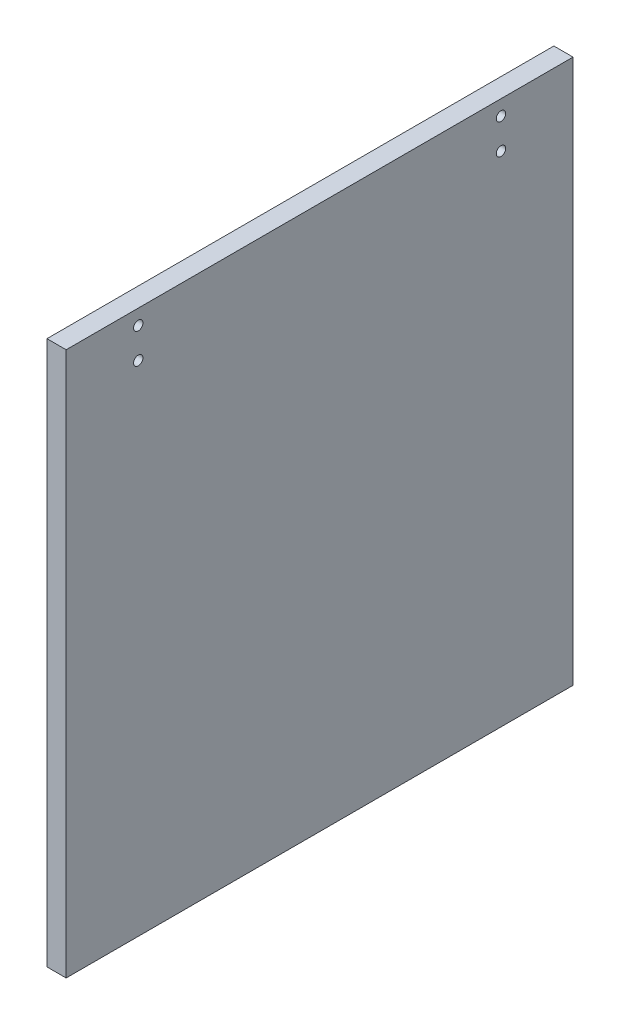
ISO-10303-21;
HEADER;
FILE_DESCRIPTION(('STEP AP214'),'2;1');
FILE_NAME('part.step','',(''),(''),'','','');
FILE_SCHEMA(('AUTOMOTIVE_DESIGN { 1 0 10303 214 1 1 1 1 }'));
ENDSEC;
DATA;
#1=APPLICATION_CONTEXT('core data for automotive mechanical design processes');
#2=APPLICATION_PROTOCOL_DEFINITION('international standard','automotive_design',2000,#1);
#3=PRODUCT_CONTEXT('',#1,'mechanical');
#4=PRODUCT('Part','Part','',(#3));
#5=PRODUCT_RELATED_PRODUCT_CATEGORY('part','',(#4));
#6=PRODUCT_DEFINITION_FORMATION('','',#4);
#7=PRODUCT_DEFINITION_CONTEXT('part definition',#1,'design');
#8=PRODUCT_DEFINITION('design','',#6,#7);
#9=PRODUCT_DEFINITION_SHAPE('','',#8);
#10=(LENGTH_UNIT() NAMED_UNIT(*) SI_UNIT(.MILLI.,.METRE.));
#11=(NAMED_UNIT(*) PLANE_ANGLE_UNIT() SI_UNIT($,.RADIAN.));
#12=(NAMED_UNIT(*) SI_UNIT($,.STERADIAN.) SOLID_ANGLE_UNIT());
#13=UNCERTAINTY_MEASURE_WITH_UNIT(LENGTH_MEASURE(1.E-05),#10,'distance_accuracy_value','');
#14=(GEOMETRIC_REPRESENTATION_CONTEXT(3) GLOBAL_UNCERTAINTY_ASSIGNED_CONTEXT((#13)) GLOBAL_UNIT_ASSIGNED_CONTEXT((#10,
#11,#12)) REPRESENTATION_CONTEXT('',''));
#15=CARTESIAN_POINT('',(0.,0.,0.));
#16=DIRECTION('',(0.,0.,1.));
#17=DIRECTION('',(1.,0.,0.));
#18=AXIS2_PLACEMENT_3D('',#15,#16,#17);
#19=CARTESIAN_POINT('',(6.35,-90.,83.85));
#20=DIRECTION('',(0.,0.,-1.));
#21=DIRECTION('',(-1.,0.,0.));
#22=AXIS2_PLACEMENT_3D('',#19,#20,#21);
#23=PLANE('',#22);
#24=DIRECTION('',(0.,-1.,0.));
#25=VECTOR('',#24,1.);
#26=CARTESIAN_POINT('',(0.,-90.,83.85));
#27=LINE('',#26,#25);
#28=CARTESIAN_POINT('',(0.,90.,83.85));
#29=VERTEX_POINT('',#28);
#30=CARTESIAN_POINT('',(0.,-90.,83.85));
#31=VERTEX_POINT('',#30);
#32=EDGE_CURVE('E96',#29,#31,#27,.T.);
#33=ORIENTED_EDGE('',*,*,#32,.T.);
#34=DIRECTION('',(-1.,0.,0.));
#35=VECTOR('',#34,1.);
#36=CARTESIAN_POINT('',(6.35,-90.,83.85));
#37=LINE('',#36,#35);
#38=CARTESIAN_POINT('',(6.35,-90.,83.85));
#39=VERTEX_POINT('',#38);
#40=EDGE_CURVE('E11',#39,#31,#37,.T.);
#41=ORIENTED_EDGE('',*,*,#40,.F.);
#42=DIRECTION('',(0.,-1.,0.));
#43=VECTOR('',#42,1.);
#44=CARTESIAN_POINT('',(6.35,-90.,83.85));
#45=LINE('',#44,#43);
#46=CARTESIAN_POINT('',(6.35,90.,83.85));
#47=VERTEX_POINT('',#46);
#48=EDGE_CURVE('E84',#47,#39,#45,.T.);
#49=ORIENTED_EDGE('',*,*,#48,.F.);
#50=DIRECTION('',(-1.,0.,0.));
#51=VECTOR('',#50,1.);
#52=CARTESIAN_POINT('',(6.35,90.,83.85));
#53=LINE('',#52,#51);
#54=EDGE_CURVE('E92',#47,#29,#53,.T.);
#55=ORIENTED_EDGE('',*,*,#54,.T.);
#56=EDGE_LOOP('',(#33,#41,#49,#55));
#57=FACE_BOUND('',#56,.T.);
#58=ADVANCED_FACE('F33',(#57),#23,.F.);
#59=CARTESIAN_POINT('',(6.35,-90.,-83.85));
#60=DIRECTION('',(0.,1.,0.));
#61=DIRECTION('',(0.,0.,1.));
#62=AXIS2_PLACEMENT_3D('',#59,#60,#61);
#63=PLANE('',#62);
#64=DIRECTION('',(0.,0.,-1.));
#65=VECTOR('',#64,1.);
#66=CARTESIAN_POINT('',(0.,-90.,-83.85));
#67=LINE('',#66,#65);
#68=CARTESIAN_POINT('',(0.,-90.,-83.85));
#69=VERTEX_POINT('',#68);
#70=EDGE_CURVE('E88',#31,#69,#67,.T.);
#71=ORIENTED_EDGE('',*,*,#70,.T.);
#72=DIRECTION('',(-1.,0.,0.));
#73=VECTOR('',#72,1.);
#74=CARTESIAN_POINT('',(6.35,-90.,-83.85));
#75=LINE('',#74,#73);
#76=CARTESIAN_POINT('',(6.35,-90.,-83.85));
#77=VERTEX_POINT('',#76);
#78=EDGE_CURVE('E41',#77,#69,#75,.T.);
#79=ORIENTED_EDGE('',*,*,#78,.F.);
#80=DIRECTION('',(0.,0.,-1.));
#81=VECTOR('',#80,1.);
#82=CARTESIAN_POINT('',(6.35,-90.,-83.85));
#83=LINE('',#82,#81);
#84=EDGE_CURVE('E79',#39,#77,#83,.T.);
#85=ORIENTED_EDGE('',*,*,#84,.F.);
#86=ORIENTED_EDGE('',*,*,#40,.T.);
#87=EDGE_LOOP('',(#71,#79,#85,#86));
#88=FACE_BOUND('',#87,.T.);
#89=ADVANCED_FACE('F87',(#88),#63,.F.);
#90=CARTESIAN_POINT('',(6.35,-90.,-83.85));
#91=DIRECTION('',(0.,0.,1.));
#92=DIRECTION('',(1.,0.,0.));
#93=AXIS2_PLACEMENT_3D('',#90,#91,#92);
#94=PLANE('',#93);
#95=DIRECTION('',(0.,1.,0.));
#96=VECTOR('',#95,1.);
#97=CARTESIAN_POINT('',(0.,-90.,-83.85));
#98=LINE('',#97,#96);
#99=CARTESIAN_POINT('',(0.,90.,-83.85));
#100=VERTEX_POINT('',#99);
#101=EDGE_CURVE('E66',#69,#100,#98,.T.);
#102=ORIENTED_EDGE('',*,*,#101,.T.);
#103=DIRECTION('',(-1.,0.,0.));
#104=VECTOR('',#103,1.);
#105=CARTESIAN_POINT('',(6.35,90.,-83.85));
#106=LINE('',#105,#104);
#107=CARTESIAN_POINT('',(6.35,90.,-83.85));
#108=VERTEX_POINT('',#107);
#109=EDGE_CURVE('E89',#108,#100,#106,.T.);
#110=ORIENTED_EDGE('',*,*,#109,.F.);
#111=DIRECTION('',(0.,1.,0.));
#112=VECTOR('',#111,1.);
#113=CARTESIAN_POINT('',(6.35,-90.,-83.85));
#114=LINE('',#113,#112);
#115=EDGE_CURVE('E82',#77,#108,#114,.T.);
#116=ORIENTED_EDGE('',*,*,#115,.F.);
#117=ORIENTED_EDGE('',*,*,#78,.T.);
#118=EDGE_LOOP('',(#102,#110,#116,#117));
#119=FACE_BOUND('',#118,.T.);
#120=ADVANCED_FACE('F90',(#119),#94,.F.);
#121=CARTESIAN_POINT('',(6.35,90.,-83.85));
#122=DIRECTION('',(0.,-1.,0.));
#123=DIRECTION('',(0.,0.,-1.));
#124=AXIS2_PLACEMENT_3D('',#121,#122,#123);
#125=PLANE('',#124);
#126=DIRECTION('',(0.,0.,1.));
#127=VECTOR('',#126,1.);
#128=CARTESIAN_POINT('',(0.,90.,-83.85));
#129=LINE('',#128,#127);
#130=EDGE_CURVE('E72',#100,#29,#129,.T.);
#131=ORIENTED_EDGE('',*,*,#130,.T.);
#132=ORIENTED_EDGE('',*,*,#54,.F.);
#133=DIRECTION('',(0.,0.,1.));
#134=VECTOR('',#133,1.);
#135=CARTESIAN_POINT('',(6.35,90.,-83.85));
#136=LINE('',#135,#134);
#137=EDGE_CURVE('E49',#108,#47,#136,.T.);
#138=ORIENTED_EDGE('',*,*,#137,.F.);
#139=ORIENTED_EDGE('',*,*,#109,.T.);
#140=EDGE_LOOP('',(#131,#132,#138,#139));
#141=FACE_BOUND('',#140,.T.);
#142=ADVANCED_FACE('F104',(#141),#125,.F.);
#143=CARTESIAN_POINT('',(6.35,0.,0.));
#144=DIRECTION('',(1.,0.,0.));
#145=DIRECTION('',(0.,0.,-1.));
#146=AXIS2_PLACEMENT_3D('',#143,#144,#145);
#147=PLANE('',#146);
#148=CARTESIAN_POINT('',(6.35,74.9999995282547,59.999999948));
#149=DIRECTION('',(-1.,0.,0.));
#150=DIRECTION('',(0.,0.,1.));
#151=AXIS2_PLACEMENT_3D('',#148,#149,#150);
#152=CIRCLE('',#151,1.554);
#153=CARTESIAN_POINT('',(6.35,74.9999995282547,61.553999948));
#154=VERTEX_POINT('',#153);
#155=EDGE_CURVE('E125',#154,#154,#152,.T.);
#156=ORIENTED_EDGE('',*,*,#155,.T.);
#157=EDGE_LOOP('',(#156));
#158=FACE_BOUND('',#157,.T.);
#159=CARTESIAN_POINT('',(6.35,74.9999995282547,-59.999999948));
#160=DIRECTION('',(-1.,0.,0.));
#161=DIRECTION('',(0.,0.,1.));
#162=AXIS2_PLACEMENT_3D('',#159,#160,#161);
#163=CIRCLE('',#162,1.554);
#164=CARTESIAN_POINT('',(6.35,74.9999995282547,-58.445999948));
#165=VERTEX_POINT('',#164);
#166=EDGE_CURVE('E119',#165,#165,#163,.T.);
#167=ORIENTED_EDGE('',*,*,#166,.T.);
#168=EDGE_LOOP('',(#167));
#169=FACE_BOUND('',#168,.T.);
#170=CARTESIAN_POINT('',(6.35,84.9999995282547,-59.999999948));
#171=DIRECTION('',(-1.,0.,0.));
#172=DIRECTION('',(0.,0.,1.));
#173=AXIS2_PLACEMENT_3D('',#170,#171,#172);
#174=CIRCLE('',#173,1.55400000000002);
#175=CARTESIAN_POINT('',(6.35,84.9999995282547,-58.445999948));
#176=VERTEX_POINT('',#175);
#177=EDGE_CURVE('E113',#176,#176,#174,.T.);
#178=ORIENTED_EDGE('',*,*,#177,.T.);
#179=EDGE_LOOP('',(#178));
#180=FACE_BOUND('',#179,.T.);
#181=CARTESIAN_POINT('',(6.35,84.9999995282547,59.999999948));
#182=DIRECTION('',(-1.,0.,0.));
#183=DIRECTION('',(0.,0.,1.));
#184=AXIS2_PLACEMENT_3D('',#181,#182,#183);
#185=CIRCLE('',#184,1.55400000000002);
#186=CARTESIAN_POINT('',(6.35,84.9999995282547,61.553999948));
#187=VERTEX_POINT('',#186);
#188=EDGE_CURVE('E99',#187,#187,#185,.T.);
#189=ORIENTED_EDGE('',*,*,#188,.T.);
#190=EDGE_LOOP('',(#189));
#191=FACE_BOUND('',#190,.T.);
#192=ORIENTED_EDGE('',*,*,#48,.T.);
#193=ORIENTED_EDGE('',*,*,#84,.T.);
#194=ORIENTED_EDGE('',*,*,#115,.T.);
#195=ORIENTED_EDGE('',*,*,#137,.T.);
#196=EDGE_LOOP('',(#192,#193,#194,#195));
#197=FACE_BOUND('',#196,.T.);
#198=ADVANCED_FACE('F80',(#158,#169,#180,#191,#197),#147,.T.);
#199=CARTESIAN_POINT('',(0.,0.,0.));
#200=DIRECTION('',(1.,0.,0.));
#201=DIRECTION('',(0.,0.,-1.));
#202=AXIS2_PLACEMENT_3D('',#199,#200,#201);
#203=PLANE('',#202);
#204=CARTESIAN_POINT('',(0.,74.9999995282547,59.999999948));
#205=DIRECTION('',(-1.,0.,0.));
#206=DIRECTION('',(0.,0.,1.));
#207=AXIS2_PLACEMENT_3D('',#204,#205,#206);
#208=CIRCLE('',#207,1.554);
#209=CARTESIAN_POINT('',(0.,74.9999995282547,61.553999948));
#210=VERTEX_POINT('',#209);
#211=EDGE_CURVE('E128',#210,#210,#208,.T.);
#212=ORIENTED_EDGE('',*,*,#211,.F.);
#213=EDGE_LOOP('',(#212));
#214=FACE_BOUND('',#213,.T.);
#215=CARTESIAN_POINT('',(0.,74.9999995282547,-59.999999948));
#216=DIRECTION('',(-1.,0.,0.));
#217=DIRECTION('',(0.,0.,1.));
#218=AXIS2_PLACEMENT_3D('',#215,#216,#217);
#219=CIRCLE('',#218,1.554);
#220=CARTESIAN_POINT('',(0.,74.9999995282547,-58.445999948));
#221=VERTEX_POINT('',#220);
#222=EDGE_CURVE('E122',#221,#221,#219,.T.);
#223=ORIENTED_EDGE('',*,*,#222,.F.);
#224=EDGE_LOOP('',(#223));
#225=FACE_BOUND('',#224,.T.);
#226=CARTESIAN_POINT('',(0.,84.9999995282547,-59.999999948));
#227=DIRECTION('',(-1.,0.,0.));
#228=DIRECTION('',(0.,0.,1.));
#229=AXIS2_PLACEMENT_3D('',#226,#227,#228);
#230=CIRCLE('',#229,1.55400000000002);
#231=CARTESIAN_POINT('',(0.,84.9999995282547,-58.445999948));
#232=VERTEX_POINT('',#231);
#233=EDGE_CURVE('E116',#232,#232,#230,.T.);
#234=ORIENTED_EDGE('',*,*,#233,.F.);
#235=EDGE_LOOP('',(#234));
#236=FACE_BOUND('',#235,.T.);
#237=CARTESIAN_POINT('',(0.,84.9999995282547,59.999999948));
#238=DIRECTION('',(-1.,0.,0.));
#239=DIRECTION('',(0.,0.,1.));
#240=AXIS2_PLACEMENT_3D('',#237,#238,#239);
#241=CIRCLE('',#240,1.55400000000002);
#242=CARTESIAN_POINT('',(0.,84.9999995282547,61.553999948));
#243=VERTEX_POINT('',#242);
#244=EDGE_CURVE('E110',#243,#243,#241,.T.);
#245=ORIENTED_EDGE('',*,*,#244,.F.);
#246=EDGE_LOOP('',(#245));
#247=FACE_BOUND('',#246,.T.);
#248=ORIENTED_EDGE('',*,*,#32,.F.);
#249=ORIENTED_EDGE('',*,*,#130,.F.);
#250=ORIENTED_EDGE('',*,*,#101,.F.);
#251=ORIENTED_EDGE('',*,*,#70,.F.);
#252=EDGE_LOOP('',(#248,#249,#250,#251));
#253=FACE_BOUND('',#252,.T.);
#254=ADVANCED_FACE('F107',(#214,#225,#236,#247,#253),#203,.F.);
#255=CARTESIAN_POINT('',(6.35,84.9999995282547,59.999999948));
#256=DIRECTION('',(-1.,0.,0.));
#257=DIRECTION('',(0.,0.,1.));
#258=AXIS2_PLACEMENT_3D('',#255,#256,#257);
#259=CYLINDRICAL_SURFACE('',#258,1.55400000000002);
#260=ORIENTED_EDGE('',*,*,#188,.F.);
#261=EDGE_LOOP('',(#260));
#262=FACE_BOUND('',#261,.T.);
#263=ORIENTED_EDGE('',*,*,#244,.T.);
#264=EDGE_LOOP('',(#263));
#265=FACE_BOUND('',#264,.T.);
#266=ADVANCED_FACE('F145',(#262,#265),#259,.F.);
#267=CARTESIAN_POINT('',(6.35,84.9999995282547,-59.999999948));
#268=DIRECTION('',(-1.,0.,0.));
#269=DIRECTION('',(0.,0.,1.));
#270=AXIS2_PLACEMENT_3D('',#267,#268,#269);
#271=CYLINDRICAL_SURFACE('',#270,1.55400000000002);
#272=ORIENTED_EDGE('',*,*,#177,.F.);
#273=EDGE_LOOP('',(#272));
#274=FACE_BOUND('',#273,.T.);
#275=ORIENTED_EDGE('',*,*,#233,.T.);
#276=EDGE_LOOP('',(#275));
#277=FACE_BOUND('',#276,.T.);
#278=ADVANCED_FACE('F154',(#274,#277),#271,.F.);
#279=CARTESIAN_POINT('',(6.35,74.9999995282547,-59.999999948));
#280=DIRECTION('',(-1.,0.,0.));
#281=DIRECTION('',(0.,0.,1.));
#282=AXIS2_PLACEMENT_3D('',#279,#280,#281);
#283=CYLINDRICAL_SURFACE('',#282,1.554);
#284=ORIENTED_EDGE('',*,*,#166,.F.);
#285=EDGE_LOOP('',(#284));
#286=FACE_BOUND('',#285,.T.);
#287=ORIENTED_EDGE('',*,*,#222,.T.);
#288=EDGE_LOOP('',(#287));
#289=FACE_BOUND('',#288,.T.);
#290=ADVANCED_FACE('F139',(#286,#289),#283,.F.);
#291=CARTESIAN_POINT('',(6.35,74.9999995282547,59.999999948));
#292=DIRECTION('',(-1.,0.,0.));
#293=DIRECTION('',(0.,0.,1.));
#294=AXIS2_PLACEMENT_3D('',#291,#292,#293);
#295=CYLINDRICAL_SURFACE('',#294,1.554);
#296=ORIENTED_EDGE('',*,*,#155,.F.);
#297=EDGE_LOOP('',(#296));
#298=FACE_BOUND('',#297,.T.);
#299=ORIENTED_EDGE('',*,*,#211,.T.);
#300=EDGE_LOOP('',(#299));
#301=FACE_BOUND('',#300,.T.);
#302=ADVANCED_FACE('F136',(#298,#301),#295,.F.);
#303=CLOSED_SHELL('',(#58,#89,#120,#142,#198,#254,#266,#278,#290,#302));
#304=MANIFOLD_SOLID_BREP('B2',#303);
#305=ADVANCED_BREP_SHAPE_REPRESENTATION('',(#18,#304),#14);
#306=SHAPE_DEFINITION_REPRESENTATION(#9,#305);
ENDSEC;
END-ISO-10303-21;
